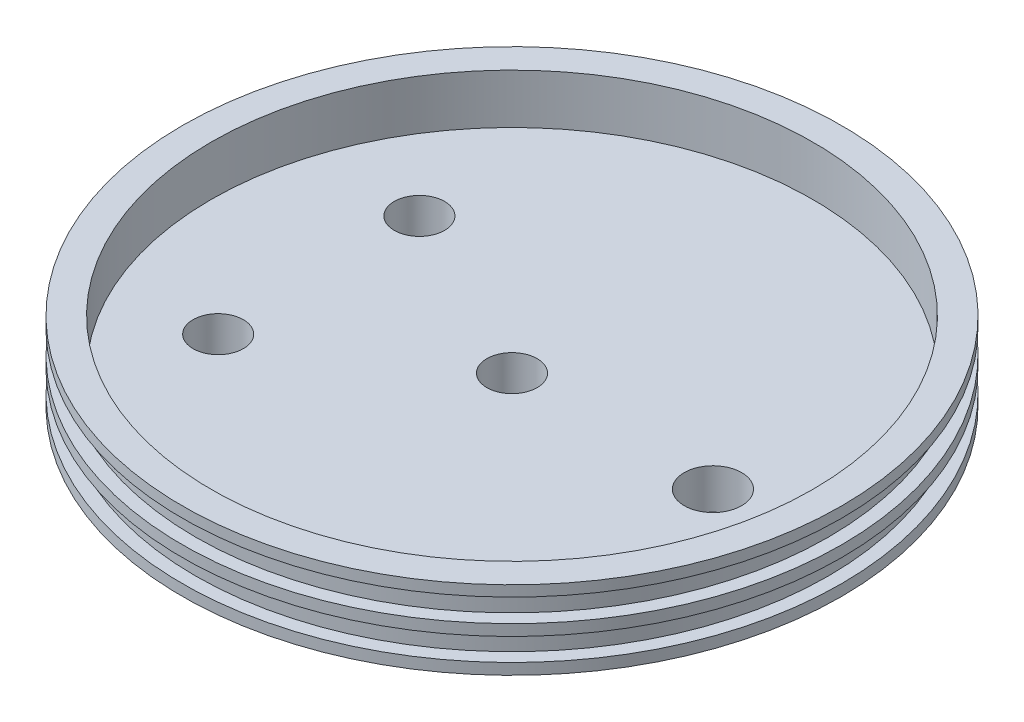
ISO-10303-21;
HEADER;
FILE_DESCRIPTION(('STEP AP214'),'2;1');
FILE_NAME('part.step','',(''),(''),'','','');
FILE_SCHEMA(('AUTOMOTIVE_DESIGN { 1 0 10303 214 1 1 1 1 }'));
ENDSEC;
DATA;
#1=APPLICATION_CONTEXT('core data for automotive mechanical design processes');
#2=APPLICATION_PROTOCOL_DEFINITION('international standard','automotive_design',2000,#1);
#3=PRODUCT_CONTEXT('',#1,'mechanical');
#4=PRODUCT('Part','Part','',(#3));
#5=PRODUCT_RELATED_PRODUCT_CATEGORY('part','',(#4));
#6=PRODUCT_DEFINITION_FORMATION('','',#4);
#7=PRODUCT_DEFINITION_CONTEXT('part definition',#1,'design');
#8=PRODUCT_DEFINITION('design','',#6,#7);
#9=PRODUCT_DEFINITION_SHAPE('','',#8);
#10=(LENGTH_UNIT() NAMED_UNIT(*) SI_UNIT(.MILLI.,.METRE.));
#11=(NAMED_UNIT(*) PLANE_ANGLE_UNIT() SI_UNIT($,.RADIAN.));
#12=(NAMED_UNIT(*) SI_UNIT($,.STERADIAN.) SOLID_ANGLE_UNIT());
#13=UNCERTAINTY_MEASURE_WITH_UNIT(LENGTH_MEASURE(1.E-05),#10,'distance_accuracy_value','');
#14=(GEOMETRIC_REPRESENTATION_CONTEXT(3) GLOBAL_UNCERTAINTY_ASSIGNED_CONTEXT((#13)) GLOBAL_UNIT_ASSIGNED_CONTEXT((#10,
#11,#12)) REPRESENTATION_CONTEXT('',''));
#15=CARTESIAN_POINT('',(0.,0.,0.));
#16=DIRECTION('',(0.,0.,1.));
#17=DIRECTION('',(1.,0.,0.));
#18=AXIS2_PLACEMENT_3D('',#15,#16,#17);
#19=CARTESIAN_POINT('',(0.,0.,0.));
#20=DIRECTION('',(0.,1.,0.));
#21=DIRECTION('',(-1.,0.,0.));
#22=AXIS2_PLACEMENT_3D('',#19,#20,#21);
#23=PLANE('',#22);
#24=CARTESIAN_POINT('',(0.,0.,0.));
#25=DIRECTION('',(0.,-1.,0.));
#26=DIRECTION('',(1.,0.,0.));
#27=AXIS2_PLACEMENT_3D('',#24,#25,#26);
#28=CIRCLE('',#27,66.04);
#29=CARTESIAN_POINT('',(66.04,0.,0.));
#30=VERTEX_POINT('',#29);
#31=EDGE_CURVE('E10',#30,#30,#28,.T.);
#32=ORIENTED_EDGE('',*,*,#31,.F.);
#33=EDGE_LOOP('',(#32));
#34=FACE_BOUND('',#33,.T.);
#35=CARTESIAN_POINT('',(0.,0.,0.));
#36=DIRECTION('',(0.,1.,0.));
#37=DIRECTION('',(-1.,0.,0.));
#38=AXIS2_PLACEMENT_3D('',#35,#36,#37);
#39=CIRCLE('',#38,72.898);
#40=CARTESIAN_POINT('',(-72.898,0.,0.));
#41=VERTEX_POINT('',#40);
#42=EDGE_CURVE('E44',#41,#41,#39,.T.);
#43=ORIENTED_EDGE('',*,*,#42,.F.);
#44=EDGE_LOOP('',(#43));
#45=FACE_BOUND('',#44,.T.);
#46=ADVANCED_FACE('F41',(#34,#45),#23,.F.);
#47=CARTESIAN_POINT('',(0.,48.1922132313012,0.));
#48=DIRECTION('',(0.,1.,0.));
#49=DIRECTION('',(-1.,0.,0.));
#50=AXIS2_PLACEMENT_3D('',#47,#48,#49);
#51=CYLINDRICAL_SURFACE('',#50,72.898);
#52=CARTESIAN_POINT('',(0.,2.4638,0.));
#53=DIRECTION('',(0.,1.,0.));
#54=DIRECTION('',(-1.,0.,0.));
#55=AXIS2_PLACEMENT_3D('',#52,#53,#54);
#56=CIRCLE('',#55,72.898);
#57=CARTESIAN_POINT('',(-72.898,2.46379999999999,0.));
#58=VERTEX_POINT('',#57);
#59=EDGE_CURVE('E52',#58,#58,#56,.T.);
#60=ORIENTED_EDGE('',*,*,#59,.F.);
#61=EDGE_LOOP('',(#60));
#62=FACE_BOUND('',#61,.T.);
#63=ORIENTED_EDGE('',*,*,#42,.T.);
#64=EDGE_LOOP('',(#63));
#65=FACE_BOUND('',#64,.T.);
#66=ADVANCED_FACE('F91',(#62,#65),#51,.T.);
#67=CARTESIAN_POINT('',(72.898,2.4638,0.));
#68=DIRECTION('',(0.,-1.,0.));
#69=DIRECTION('',(1.,0.,0.));
#70=AXIS2_PLACEMENT_3D('',#67,#68,#69);
#71=PLANE('',#70);
#72=CARTESIAN_POINT('',(0.,2.4638,0.));
#73=DIRECTION('',(0.,1.,0.));
#74=DIRECTION('',(-1.,0.,0.));
#75=AXIS2_PLACEMENT_3D('',#72,#73,#74);
#76=CIRCLE('',#75,69.977);
#77=CARTESIAN_POINT('',(-69.977,2.46379999999999,0.));
#78=VERTEX_POINT('',#77);
#79=EDGE_CURVE('E84',#78,#78,#76,.T.);
#80=ORIENTED_EDGE('',*,*,#79,.F.);
#81=EDGE_LOOP('',(#80));
#82=FACE_BOUND('',#81,.T.);
#83=ORIENTED_EDGE('',*,*,#59,.T.);
#84=EDGE_LOOP('',(#83));
#85=FACE_BOUND('',#84,.T.);
#86=ADVANCED_FACE('F89',(#82,#85),#71,.F.);
#87=CARTESIAN_POINT('',(0.,48.1922132313012,0.));
#88=DIRECTION('',(0.,1.,0.));
#89=DIRECTION('',(-1.,0.,0.));
#90=AXIS2_PLACEMENT_3D('',#87,#88,#89);
#91=CYLINDRICAL_SURFACE('',#90,69.977);
#92=CARTESIAN_POINT('',(0.,7.44219999999999,0.));
#93=DIRECTION('',(0.,1.,0.));
#94=DIRECTION('',(-1.,0.,0.));
#95=AXIS2_PLACEMENT_3D('',#92,#93,#94);
#96=CIRCLE('',#95,69.977);
#97=CARTESIAN_POINT('',(-69.977,7.44219999999998,0.));
#98=VERTEX_POINT('',#97);
#99=EDGE_CURVE('E81',#98,#98,#96,.T.);
#100=ORIENTED_EDGE('',*,*,#99,.F.);
#101=EDGE_LOOP('',(#100));
#102=FACE_BOUND('',#101,.T.);
#103=ORIENTED_EDGE('',*,*,#79,.T.);
#104=EDGE_LOOP('',(#103));
#105=FACE_BOUND('',#104,.T.);
#106=ADVANCED_FACE('F244',(#102,#105),#91,.T.);
#107=CARTESIAN_POINT('',(69.977,7.4422,0.));
#108=DIRECTION('',(0.,1.,0.));
#109=DIRECTION('',(-1.,0.,0.));
#110=AXIS2_PLACEMENT_3D('',#107,#108,#109);
#111=PLANE('',#110);
#112=CARTESIAN_POINT('',(0.,7.44219999999999,0.));
#113=DIRECTION('',(0.,1.,0.));
#114=DIRECTION('',(-1.,0.,0.));
#115=AXIS2_PLACEMENT_3D('',#112,#113,#114);
#116=CIRCLE('',#115,72.898);
#117=CARTESIAN_POINT('',(-72.898,7.44219999999998,0.));
#118=VERTEX_POINT('',#117);
#119=EDGE_CURVE('E78',#118,#118,#116,.T.);
#120=ORIENTED_EDGE('',*,*,#119,.F.);
#121=EDGE_LOOP('',(#120));
#122=FACE_BOUND('',#121,.T.);
#123=ORIENTED_EDGE('',*,*,#99,.T.);
#124=EDGE_LOOP('',(#123));
#125=FACE_BOUND('',#124,.T.);
#126=ADVANCED_FACE('F235',(#122,#125),#111,.F.);
#127=CARTESIAN_POINT('',(0.,48.1922132313012,0.));
#128=DIRECTION('',(0.,1.,0.));
#129=DIRECTION('',(-1.,0.,0.));
#130=AXIS2_PLACEMENT_3D('',#127,#128,#129);
#131=CYLINDRICAL_SURFACE('',#130,72.898);
#132=CARTESIAN_POINT('',(0.,9.90599999999999,0.));
#133=DIRECTION('',(0.,1.,0.));
#134=DIRECTION('',(-1.,0.,0.));
#135=AXIS2_PLACEMENT_3D('',#132,#133,#134);
#136=CIRCLE('',#135,72.898);
#137=CARTESIAN_POINT('',(-72.898,9.90599999999998,0.));
#138=VERTEX_POINT('',#137);
#139=EDGE_CURVE('E75',#138,#138,#136,.T.);
#140=ORIENTED_EDGE('',*,*,#139,.F.);
#141=EDGE_LOOP('',(#140));
#142=FACE_BOUND('',#141,.T.);
#143=ORIENTED_EDGE('',*,*,#119,.T.);
#144=EDGE_LOOP('',(#143));
#145=FACE_BOUND('',#144,.T.);
#146=ADVANCED_FACE('F226',(#142,#145),#131,.T.);
#147=CARTESIAN_POINT('',(72.898,9.906,0.));
#148=DIRECTION('',(0.,-1.,0.));
#149=DIRECTION('',(1.,0.,0.));
#150=AXIS2_PLACEMENT_3D('',#147,#148,#149);
#151=PLANE('',#150);
#152=CARTESIAN_POINT('',(0.,9.90599999999999,0.));
#153=DIRECTION('',(0.,1.,0.));
#154=DIRECTION('',(-1.,0.,0.));
#155=AXIS2_PLACEMENT_3D('',#152,#153,#154);
#156=CIRCLE('',#155,69.977);
#157=CARTESIAN_POINT('',(-69.977,9.90599999999998,0.));
#158=VERTEX_POINT('',#157);
#159=EDGE_CURVE('E72',#158,#158,#156,.T.);
#160=ORIENTED_EDGE('',*,*,#159,.F.);
#161=EDGE_LOOP('',(#160));
#162=FACE_BOUND('',#161,.T.);
#163=ORIENTED_EDGE('',*,*,#139,.T.);
#164=EDGE_LOOP('',(#163));
#165=FACE_BOUND('',#164,.T.);
#166=ADVANCED_FACE('F217',(#162,#165),#151,.F.);
#167=CARTESIAN_POINT('',(0.,48.1922132313012,0.));
#168=DIRECTION('',(0.,1.,0.));
#169=DIRECTION('',(-1.,0.,0.));
#170=AXIS2_PLACEMENT_3D('',#167,#168,#169);
#171=CYLINDRICAL_SURFACE('',#170,69.977);
#172=CARTESIAN_POINT('',(0.,14.986,0.));
#173=DIRECTION('',(0.,1.,0.));
#174=DIRECTION('',(-1.,0.,0.));
#175=AXIS2_PLACEMENT_3D('',#172,#173,#174);
#176=CIRCLE('',#175,69.977);
#177=CARTESIAN_POINT('',(-69.977,14.986,0.));
#178=VERTEX_POINT('',#177);
#179=EDGE_CURVE('E69',#178,#178,#176,.T.);
#180=ORIENTED_EDGE('',*,*,#179,.F.);
#181=EDGE_LOOP('',(#180));
#182=FACE_BOUND('',#181,.T.);
#183=ORIENTED_EDGE('',*,*,#159,.T.);
#184=EDGE_LOOP('',(#183));
#185=FACE_BOUND('',#184,.T.);
#186=ADVANCED_FACE('F208',(#182,#185),#171,.T.);
#187=CARTESIAN_POINT('',(69.977,14.986,0.));
#188=DIRECTION('',(0.,1.,0.));
#189=DIRECTION('',(-1.,0.,0.));
#190=AXIS2_PLACEMENT_3D('',#187,#188,#189);
#191=PLANE('',#190);
#192=CARTESIAN_POINT('',(0.,14.986,0.));
#193=DIRECTION('',(0.,1.,0.));
#194=DIRECTION('',(-1.,0.,0.));
#195=AXIS2_PLACEMENT_3D('',#192,#193,#194);
#196=CIRCLE('',#195,72.898);
#197=CARTESIAN_POINT('',(-72.898,14.986,0.));
#198=VERTEX_POINT('',#197);
#199=EDGE_CURVE('E66',#198,#198,#196,.T.);
#200=ORIENTED_EDGE('',*,*,#199,.F.);
#201=EDGE_LOOP('',(#200));
#202=FACE_BOUND('',#201,.T.);
#203=ORIENTED_EDGE('',*,*,#179,.T.);
#204=EDGE_LOOP('',(#203));
#205=FACE_BOUND('',#204,.T.);
#206=ADVANCED_FACE('F199',(#202,#205),#191,.F.);
#207=CARTESIAN_POINT('',(0.,48.1922132313012,0.));
#208=DIRECTION('',(0.,1.,0.));
#209=DIRECTION('',(-1.,0.,0.));
#210=AXIS2_PLACEMENT_3D('',#207,#208,#209);
#211=CYLINDRICAL_SURFACE('',#210,72.898);
#212=CARTESIAN_POINT('',(0.,17.3482,0.));
#213=DIRECTION('',(0.,1.,0.));
#214=DIRECTION('',(-1.,0.,0.));
#215=AXIS2_PLACEMENT_3D('',#212,#213,#214);
#216=CIRCLE('',#215,72.898);
#217=CARTESIAN_POINT('',(-72.898,17.3482,0.));
#218=VERTEX_POINT('',#217);
#219=EDGE_CURVE('E63',#218,#218,#216,.T.);
#220=ORIENTED_EDGE('',*,*,#219,.F.);
#221=EDGE_LOOP('',(#220));
#222=FACE_BOUND('',#221,.T.);
#223=ORIENTED_EDGE('',*,*,#199,.T.);
#224=EDGE_LOOP('',(#223));
#225=FACE_BOUND('',#224,.T.);
#226=ADVANCED_FACE('F190',(#222,#225),#211,.T.);
#227=CARTESIAN_POINT('',(72.898,17.3482,0.));
#228=DIRECTION('',(0.,-1.,0.));
#229=DIRECTION('',(1.,0.,0.));
#230=AXIS2_PLACEMENT_3D('',#227,#228,#229);
#231=PLANE('',#230);
#232=CARTESIAN_POINT('',(0.,17.3482,0.));
#233=DIRECTION('',(0.,1.,0.));
#234=DIRECTION('',(-1.,0.,0.));
#235=AXIS2_PLACEMENT_3D('',#232,#233,#234);
#236=CIRCLE('',#235,66.548);
#237=CARTESIAN_POINT('',(-66.548,17.3482,0.));
#238=VERTEX_POINT('',#237);
#239=EDGE_CURVE('E60',#238,#238,#236,.T.);
#240=ORIENTED_EDGE('',*,*,#239,.F.);
#241=EDGE_LOOP('',(#240));
#242=FACE_BOUND('',#241,.T.);
#243=ORIENTED_EDGE('',*,*,#219,.T.);
#244=EDGE_LOOP('',(#243));
#245=FACE_BOUND('',#244,.T.);
#246=ADVANCED_FACE('F182',(#242,#245),#231,.F.);
#247=CARTESIAN_POINT('',(0.,48.1922132313012,0.));
#248=DIRECTION('',(0.,1.,0.));
#249=DIRECTION('',(-1.,0.,0.));
#250=AXIS2_PLACEMENT_3D('',#247,#248,#249);
#251=CYLINDRICAL_SURFACE('',#250,66.548);
#252=CARTESIAN_POINT('',(0.,6.34999999999999,0.));
#253=DIRECTION('',(0.,1.,0.));
#254=DIRECTION('',(-1.,0.,0.));
#255=AXIS2_PLACEMENT_3D('',#252,#253,#254);
#256=CIRCLE('',#255,66.548);
#257=CARTESIAN_POINT('',(-66.548,6.34999999999999,0.));
#258=VERTEX_POINT('',#257);
#259=EDGE_CURVE('E57',#258,#258,#256,.T.);
#260=ORIENTED_EDGE('',*,*,#259,.F.);
#261=EDGE_LOOP('',(#260));
#262=FACE_BOUND('',#261,.T.);
#263=ORIENTED_EDGE('',*,*,#239,.T.);
#264=EDGE_LOOP('',(#263));
#265=FACE_BOUND('',#264,.T.);
#266=ADVANCED_FACE('F106',(#262,#265),#251,.F.);
#267=CARTESIAN_POINT('',(66.548,6.35,0.));
#268=DIRECTION('',(0.,-1.,0.));
#269=DIRECTION('',(1.,0.,0.));
#270=AXIS2_PLACEMENT_3D('',#267,#268,#269);
#271=PLANE('',#270);
#272=CARTESIAN_POINT('',(-39.9614272550934,6.34999999999999,25.031151170964));
#273=DIRECTION('',(0.,-1.,0.));
#274=DIRECTION('',(1.,0.,0.));
#275=AXIS2_PLACEMENT_3D('',#272,#273,#274);
#276=CIRCLE('',#275,5.56259999999999);
#277=CARTESIAN_POINT('',(-34.3988272550935,6.34999999999999,25.031151170964));
#278=VERTEX_POINT('',#277);
#279=EDGE_CURVE('E305',#278,#278,#276,.T.);
#280=ORIENTED_EDGE('',*,*,#279,.T.);
#281=EDGE_LOOP('',(#280));
#282=FACE_BOUND('',#281,.T.);
#283=CARTESIAN_POINT('',(-40.3580412289557,6.34999999999999,-19.8786251993397));
#284=DIRECTION('',(0.,-1.,0.));
#285=DIRECTION('',(1.,0.,0.));
#286=AXIS2_PLACEMENT_3D('',#283,#284,#285);
#287=CIRCLE('',#286,5.56259999999999);
#288=CARTESIAN_POINT('',(-34.7954412289557,6.34999999999999,-19.8786251993397));
#289=VERTEX_POINT('',#288);
#290=EDGE_CURVE('E309',#289,#289,#287,.T.);
#291=ORIENTED_EDGE('',*,*,#290,.T.);
#292=EDGE_LOOP('',(#291));
#293=FACE_BOUND('',#292,.T.);
#294=CARTESIAN_POINT('',(44.45,6.35,0.));
#295=DIRECTION('',(0.,-1.,0.));
#296=DIRECTION('',(1.,0.,0.));
#297=AXIS2_PLACEMENT_3D('',#294,#295,#296);
#298=CIRCLE('',#297,6.35);
#299=CARTESIAN_POINT('',(50.8,6.35,0.));
#300=VERTEX_POINT('',#299);
#301=EDGE_CURVE('E318',#300,#300,#298,.T.);
#302=ORIENTED_EDGE('',*,*,#301,.T.);
#303=EDGE_LOOP('',(#302));
#304=FACE_BOUND('',#303,.T.);
#305=CARTESIAN_POINT('',(0.,6.35,0.));
#306=DIRECTION('',(0.,1.,0.));
#307=DIRECTION('',(0.,0.,1.));
#308=AXIS2_PLACEMENT_3D('',#305,#306,#307);
#309=CIRCLE('',#308,5.56259999999999);
#310=CARTESIAN_POINT('',(0.,6.35,5.56259999999999));
#311=VERTEX_POINT('',#310);
#312=EDGE_CURVE('E321',#311,#311,#309,.T.);
#313=ORIENTED_EDGE('',*,*,#312,.F.);
#314=EDGE_LOOP('',(#313));
#315=FACE_BOUND('',#314,.T.);
#316=ORIENTED_EDGE('',*,*,#259,.T.);
#317=EDGE_LOOP('',(#316));
#318=FACE_BOUND('',#317,.T.);
#319=ADVANCED_FACE('F115',(#282,#293,#304,#315,#318),#271,.F.);
#320=CARTESIAN_POINT('',(0.,-2.54,0.));
#321=DIRECTION('',(0.,1.,0.));
#322=DIRECTION('',(-1.,0.,0.));
#323=AXIS2_PLACEMENT_3D('',#320,#321,#322);
#324=CYLINDRICAL_SURFACE('',#323,66.04);
#325=CARTESIAN_POINT('',(0.,-2.54,0.));
#326=DIRECTION('',(0.,-1.,0.));
#327=DIRECTION('',(1.,0.,0.));
#328=AXIS2_PLACEMENT_3D('',#325,#326,#327);
#329=CIRCLE('',#328,66.04);
#330=CARTESIAN_POINT('',(66.04,-2.53999999999999,0.));
#331=VERTEX_POINT('',#330);
#332=EDGE_CURVE('E55',#331,#331,#329,.T.);
#333=ORIENTED_EDGE('',*,*,#332,.F.);
#334=EDGE_LOOP('',(#333));
#335=FACE_BOUND('',#334,.T.);
#336=ORIENTED_EDGE('',*,*,#31,.T.);
#337=EDGE_LOOP('',(#336));
#338=FACE_BOUND('',#337,.T.);
#339=ADVANCED_FACE('F110',(#335,#338),#324,.T.);
#340=CARTESIAN_POINT('',(0.,-2.54,0.));
#341=DIRECTION('',(0.,-1.,0.));
#342=DIRECTION('',(1.,0.,0.));
#343=AXIS2_PLACEMENT_3D('',#340,#341,#342);
#344=PLANE('',#343);
#345=CARTESIAN_POINT('',(-39.9614272550934,-2.54000000000001,25.031151170964));
#346=DIRECTION('',(0.,-1.,0.));
#347=DIRECTION('',(0.,0.,-1.));
#348=AXIS2_PLACEMENT_3D('',#345,#346,#347);
#349=CIRCLE('',#348,5.56259999999999);
#350=CARTESIAN_POINT('',(-39.9614272550934,-2.54000000000001,19.468551170964));
#351=VERTEX_POINT('',#350);
#352=EDGE_CURVE('E302',#351,#351,#349,.T.);
#353=ORIENTED_EDGE('',*,*,#352,.F.);
#354=EDGE_LOOP('',(#353));
#355=FACE_BOUND('',#354,.T.);
#356=CARTESIAN_POINT('',(-40.3580412289557,-2.54000000000001,-19.8786251993397));
#357=DIRECTION('',(0.,-1.,0.));
#358=DIRECTION('',(0.,0.,-1.));
#359=AXIS2_PLACEMENT_3D('',#356,#357,#358);
#360=CIRCLE('',#359,5.56259999999999);
#361=CARTESIAN_POINT('',(-40.3580412289557,-2.54000000000001,-25.4412251993397));
#362=VERTEX_POINT('',#361);
#363=EDGE_CURVE('E306',#362,#362,#360,.T.);
#364=ORIENTED_EDGE('',*,*,#363,.F.);
#365=EDGE_LOOP('',(#364));
#366=FACE_BOUND('',#365,.T.);
#367=CARTESIAN_POINT('',(44.45,-2.54,0.));
#368=DIRECTION('',(0.,-1.,0.));
#369=DIRECTION('',(1.,0.,0.));
#370=AXIS2_PLACEMENT_3D('',#367,#368,#369);
#371=CIRCLE('',#370,6.35);
#372=CARTESIAN_POINT('',(50.8,-2.53999999999999,0.));
#373=VERTEX_POINT('',#372);
#374=EDGE_CURVE('E315',#373,#373,#371,.T.);
#375=ORIENTED_EDGE('',*,*,#374,.F.);
#376=EDGE_LOOP('',(#375));
#377=FACE_BOUND('',#376,.T.);
#378=CARTESIAN_POINT('',(0.,-2.54,0.));
#379=DIRECTION('',(0.,1.,0.));
#380=DIRECTION('',(0.,0.,1.));
#381=AXIS2_PLACEMENT_3D('',#378,#379,#380);
#382=CIRCLE('',#381,5.5626);
#383=CARTESIAN_POINT('',(0.,-2.54,5.5626));
#384=VERTEX_POINT('',#383);
#385=EDGE_CURVE('E323',#384,#384,#382,.T.);
#386=ORIENTED_EDGE('',*,*,#385,.T.);
#387=EDGE_LOOP('',(#386));
#388=FACE_BOUND('',#387,.T.);
#389=ORIENTED_EDGE('',*,*,#332,.T.);
#390=EDGE_LOOP('',(#389));
#391=FACE_BOUND('',#390,.T.);
#392=ADVANCED_FACE('F114',(#355,#366,#377,#388,#391),#344,.T.);
#393=CARTESIAN_POINT('',(0.,6.35,0.));
#394=DIRECTION('',(0.,1.,0.));
#395=DIRECTION('',(0.,0.,1.));
#396=AXIS2_PLACEMENT_3D('',#393,#394,#395);
#397=CYLINDRICAL_SURFACE('',#396,5.56259999999999);
#398=ORIENTED_EDGE('',*,*,#385,.F.);
#399=EDGE_LOOP('',(#398));
#400=FACE_BOUND('',#399,.T.);
#401=ORIENTED_EDGE('',*,*,#312,.T.);
#402=EDGE_LOOP('',(#401));
#403=FACE_BOUND('',#402,.T.);
#404=ADVANCED_FACE('F123',(#400,#403),#397,.F.);
#405=CARTESIAN_POINT('',(44.45,17.3482,0.));
#406=DIRECTION('',(0.,-1.,0.));
#407=DIRECTION('',(1.,0.,0.));
#408=AXIS2_PLACEMENT_3D('',#405,#406,#407);
#409=CYLINDRICAL_SURFACE('',#408,6.35);
#410=ORIENTED_EDGE('',*,*,#374,.T.);
#411=EDGE_LOOP('',(#410));
#412=FACE_BOUND('',#411,.T.);
#413=ORIENTED_EDGE('',*,*,#301,.F.);
#414=EDGE_LOOP('',(#413));
#415=FACE_BOUND('',#414,.T.);
#416=ADVANCED_FACE('F127',(#412,#415),#409,.F.);
#417=CARTESIAN_POINT('',(-40.3580412289557,-2.54,-19.8786251993397));
#418=DIRECTION('',(0.,-1.,0.));
#419=DIRECTION('',(0.,0.,-1.));
#420=AXIS2_PLACEMENT_3D('',#417,#418,#419);
#421=CYLINDRICAL_SURFACE('',#420,5.56259999999999);
#422=ORIENTED_EDGE('',*,*,#363,.T.);
#423=EDGE_LOOP('',(#422));
#424=FACE_BOUND('',#423,.T.);
#425=ORIENTED_EDGE('',*,*,#290,.F.);
#426=EDGE_LOOP('',(#425));
#427=FACE_BOUND('',#426,.T.);
#428=ADVANCED_FACE('F136',(#424,#427),#421,.F.);
#429=CARTESIAN_POINT('',(-39.9614272550934,-2.54,25.031151170964));
#430=DIRECTION('',(0.,-1.,0.));
#431=DIRECTION('',(0.,0.,-1.));
#432=AXIS2_PLACEMENT_3D('',#429,#430,#431);
#433=CYLINDRICAL_SURFACE('',#432,5.56259999999999);
#434=ORIENTED_EDGE('',*,*,#352,.T.);
#435=EDGE_LOOP('',(#434));
#436=FACE_BOUND('',#435,.T.);
#437=ORIENTED_EDGE('',*,*,#279,.F.);
#438=EDGE_LOOP('',(#437));
#439=FACE_BOUND('',#438,.T.);
#440=ADVANCED_FACE('F145',(#436,#439),#433,.F.);
#441=CLOSED_SHELL('',(#46,#66,#86,#106,#126,#146,#166,#186,#206,#226,#246,#266,#319,#339,#392,
#404,#416,#428,#440));
#442=MANIFOLD_SOLID_BREP('B2',#441);
#443=ADVANCED_BREP_SHAPE_REPRESENTATION('',(#18,#442),#14);
#444=SHAPE_DEFINITION_REPRESENTATION(#9,#443);
ENDSEC;
END-ISO-10303-21;
